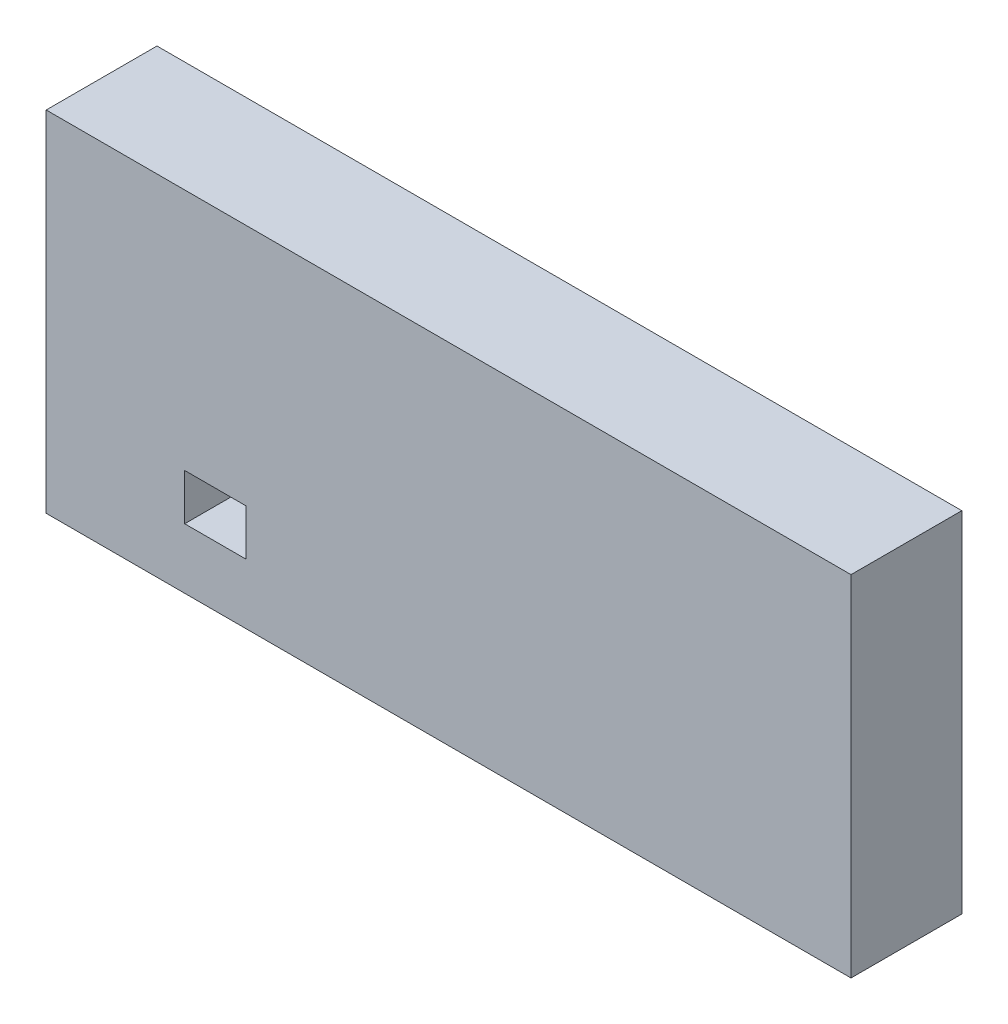
ISO-10303-21;
HEADER;
FILE_DESCRIPTION(('STEP AP214'),'2;1');
FILE_NAME('part.step','',(''),(''),'','','');
FILE_SCHEMA(('AUTOMOTIVE_DESIGN { 1 0 10303 214 1 1 1 1 }'));
ENDSEC;
DATA;
#1=APPLICATION_CONTEXT('core data for automotive mechanical design processes');
#2=APPLICATION_PROTOCOL_DEFINITION('international standard','automotive_design',2000,#1);
#3=PRODUCT_CONTEXT('',#1,'mechanical');
#4=PRODUCT('Part','Part','',(#3));
#5=PRODUCT_RELATED_PRODUCT_CATEGORY('part','',(#4));
#6=PRODUCT_DEFINITION_FORMATION('','',#4);
#7=PRODUCT_DEFINITION_CONTEXT('part definition',#1,'design');
#8=PRODUCT_DEFINITION('design','',#6,#7);
#9=PRODUCT_DEFINITION_SHAPE('','',#8);
#10=(LENGTH_UNIT() NAMED_UNIT(*) SI_UNIT(.MILLI.,.METRE.));
#11=(NAMED_UNIT(*) PLANE_ANGLE_UNIT() SI_UNIT($,.RADIAN.));
#12=(NAMED_UNIT(*) SI_UNIT($,.STERADIAN.) SOLID_ANGLE_UNIT());
#13=UNCERTAINTY_MEASURE_WITH_UNIT(LENGTH_MEASURE(1.E-05),#10,'distance_accuracy_value','');
#14=(GEOMETRIC_REPRESENTATION_CONTEXT(3) GLOBAL_UNCERTAINTY_ASSIGNED_CONTEXT((#13)) GLOBAL_UNIT_ASSIGNED_CONTEXT((#10,
#11,#12)) REPRESENTATION_CONTEXT('',''));
#15=CARTESIAN_POINT('',(0.,0.,0.));
#16=DIRECTION('',(0.,0.,1.));
#17=DIRECTION('',(1.,0.,0.));
#18=AXIS2_PLACEMENT_3D('',#15,#16,#17);
#19=CARTESIAN_POINT('',(-36.4748571428571,15.89,7.2));
#20=DIRECTION('',(1.,0.,0.));
#21=DIRECTION('',(0.,0.,-1.));
#22=AXIS2_PLACEMENT_3D('',#19,#20,#21);
#23=PLANE('',#22);
#24=DIRECTION('',(0.,-1.,0.));
#25=VECTOR('',#24,1.);
#26=CARTESIAN_POINT('',(-36.4748571428571,15.89,0.));
#27=LINE('',#26,#25);
#28=CARTESIAN_POINT('',(-36.4748571428571,15.89,0.));
#29=VERTEX_POINT('',#28);
#30=CARTESIAN_POINT('',(-36.4748571428571,-6.81,0.));
#31=VERTEX_POINT('',#30);
#32=EDGE_CURVE('E251',#29,#31,#27,.T.);
#33=ORIENTED_EDGE('',*,*,#32,.T.);
#34=DIRECTION('',(0.,0.,-1.));
#35=VECTOR('',#34,1.);
#36=CARTESIAN_POINT('',(-36.4748571428571,-6.81,7.2));
#37=LINE('',#36,#35);
#38=CARTESIAN_POINT('',(-36.4748571428571,-6.81,7.2));
#39=VERTEX_POINT('',#38);
#40=EDGE_CURVE('E11',#39,#31,#37,.T.);
#41=ORIENTED_EDGE('',*,*,#40,.F.);
#42=DIRECTION('',(0.,-1.,0.));
#43=VECTOR('',#42,1.);
#44=CARTESIAN_POINT('',(-36.4748571428571,15.89,7.2));
#45=LINE('',#44,#43);
#46=CARTESIAN_POINT('',(-36.4748571428571,15.89,7.2));
#47=VERTEX_POINT('',#46);
#48=EDGE_CURVE('E252',#47,#39,#45,.T.);
#49=ORIENTED_EDGE('',*,*,#48,.F.);
#50=DIRECTION('',(0.,0.,-1.));
#51=VECTOR('',#50,1.);
#52=CARTESIAN_POINT('',(-36.4748571428571,15.89,7.2));
#53=LINE('',#52,#51);
#54=EDGE_CURVE('E262',#47,#29,#53,.T.);
#55=ORIENTED_EDGE('',*,*,#54,.T.);
#56=EDGE_LOOP('',(#33,#41,#49,#55));
#57=FACE_BOUND('',#56,.T.);
#58=CARTESIAN_POINT('',(-36.4748571428571,8.54,2.5));
#59=DIRECTION('',(-1.,0.,0.));
#60=DIRECTION('',(0.,0.,1.));
#61=AXIS2_PLACEMENT_3D('',#58,#59,#60);
#62=CIRCLE('',#61,1.5);
#63=CARTESIAN_POINT('',(-36.4748571428571,8.54,4.));
#64=VERTEX_POINT('',#63);
#65=CARTESIAN_POINT('',(-36.4748571428571,8.54,1.));
#66=VERTEX_POINT('',#65);
#67=EDGE_CURVE('E63',#64,#66,#62,.T.);
#68=ORIENTED_EDGE('',*,*,#67,.F.);
#69=DIRECTION('',(0.,1.,0.));
#70=VECTOR('',#69,1.);
#71=CARTESIAN_POINT('',(-36.4748571428571,8.54,4.));
#72=LINE('',#71,#70);
#73=CARTESIAN_POINT('',(-36.4748571428571,0.540000000000002,4.));
#74=VERTEX_POINT('',#73);
#75=EDGE_CURVE('E195',#74,#64,#72,.T.);
#76=ORIENTED_EDGE('',*,*,#75,.F.);
#77=CARTESIAN_POINT('',(-36.4748571428571,0.540000000000002,2.5));
#78=DIRECTION('',(-1.,0.,0.));
#79=DIRECTION('',(0.,0.,1.));
#80=AXIS2_PLACEMENT_3D('',#77,#78,#79);
#81=CIRCLE('',#80,1.5);
#82=CARTESIAN_POINT('',(-36.4748571428571,0.540000000000002,1.));
#83=VERTEX_POINT('',#82);
#84=EDGE_CURVE('E206',#83,#74,#81,.T.);
#85=ORIENTED_EDGE('',*,*,#84,.F.);
#86=DIRECTION('',(0.,-1.,0.));
#87=VECTOR('',#86,1.);
#88=CARTESIAN_POINT('',(-36.4748571428571,8.54,1.));
#89=LINE('',#88,#87);
#90=EDGE_CURVE('E203',#66,#83,#89,.T.);
#91=ORIENTED_EDGE('',*,*,#90,.F.);
#92=EDGE_LOOP('',(#68,#76,#85,#91));
#93=FACE_BOUND('',#92,.T.);
#94=ADVANCED_FACE('F41',(#57,#93),#23,.F.);
#95=CARTESIAN_POINT('',(0.,0.,0.));
#96=DIRECTION('',(0.,0.,1.));
#97=DIRECTION('',(1.,0.,0.));
#98=AXIS2_PLACEMENT_3D('',#95,#96,#97);
#99=PLANE('',#98);
#100=DIRECTION('',(0.,-1.,0.));
#101=VECTOR('',#100,1.);
#102=CARTESIAN_POINT('',(9.62514285714286,-4.31,0.));
#103=LINE('',#102,#101);
#104=CARTESIAN_POINT('',(9.62514285714286,-4.31,0.));
#105=VERTEX_POINT('',#104);
#106=CARTESIAN_POINT('',(9.62514285714286,-6.81,0.));
#107=VERTEX_POINT('',#106);
#108=EDGE_CURVE('E221',#105,#107,#103,.T.);
#109=ORIENTED_EDGE('',*,*,#108,.F.);
#110=DIRECTION('',(1.,0.,0.));
#111=VECTOR('',#110,1.);
#112=CARTESIAN_POINT('',(9.62514285714286,-4.31,0.));
#113=LINE('',#112,#111);
#114=CARTESIAN_POINT('',(-30.9748571428571,-4.31,0.));
#115=VERTEX_POINT('',#114);
#116=EDGE_CURVE('E226',#115,#105,#113,.T.);
#117=ORIENTED_EDGE('',*,*,#116,.F.);
#118=DIRECTION('',(0.,1.,0.));
#119=VECTOR('',#118,1.);
#120=CARTESIAN_POINT('',(-30.9748571428571,-4.31,0.));
#121=LINE('',#120,#119);
#122=CARTESIAN_POINT('',(-30.9748571428571,-6.81,0.));
#123=VERTEX_POINT('',#122);
#124=EDGE_CURVE('E235',#123,#115,#121,.T.);
#125=ORIENTED_EDGE('',*,*,#124,.F.);
#126=DIRECTION('',(1.,0.,0.));
#127=VECTOR('',#126,1.);
#128=CARTESIAN_POINT('',(-36.4748571428571,-6.81,0.));
#129=LINE('',#128,#127);
#130=EDGE_CURVE('E266',#31,#123,#129,.T.);
#131=ORIENTED_EDGE('',*,*,#130,.F.);
#132=ORIENTED_EDGE('',*,*,#32,.F.);
#133=DIRECTION('',(-1.,0.,0.));
#134=VECTOR('',#133,1.);
#135=CARTESIAN_POINT('',(-36.4748571428571,15.89,0.));
#136=LINE('',#135,#134);
#137=CARTESIAN_POINT('',(15.8251428571429,15.89,0.));
#138=VERTEX_POINT('',#137);
#139=EDGE_CURVE('E256',#138,#29,#136,.T.);
#140=ORIENTED_EDGE('',*,*,#139,.F.);
#141=DIRECTION('',(0.,1.,0.));
#142=VECTOR('',#141,1.);
#143=CARTESIAN_POINT('',(15.8251428571429,15.89,0.));
#144=LINE('',#143,#142);
#145=CARTESIAN_POINT('',(15.8251428571429,-6.81,0.));
#146=VERTEX_POINT('',#145);
#147=EDGE_CURVE('E269',#146,#138,#144,.T.);
#148=ORIENTED_EDGE('',*,*,#147,.F.);
#149=EDGE_CURVE('E265',#107,#146,#129,.T.);
#150=ORIENTED_EDGE('',*,*,#149,.F.);
#151=EDGE_LOOP('',(#109,#117,#125,#131,#132,#140,#148,#150));
#152=FACE_BOUND('',#151,.T.);
#153=ADVANCED_FACE('F286',(#152),#99,.F.);
#154=CARTESIAN_POINT('',(-36.4748571428571,-6.81,7.2));
#155=DIRECTION('',(0.,1.,0.));
#156=DIRECTION('',(0.,0.,1.));
#157=AXIS2_PLACEMENT_3D('',#154,#155,#156);
#158=PLANE('',#157);
#159=ORIENTED_EDGE('',*,*,#130,.T.);
#160=DIRECTION('',(0.,0.,1.));
#161=VECTOR('',#160,1.);
#162=CARTESIAN_POINT('',(-30.9748571428571,-6.81,-2.));
#163=LINE('',#162,#161);
#164=CARTESIAN_POINT('',(-30.9748571428571,-6.81,-2.));
#165=VERTEX_POINT('',#164);
#166=EDGE_CURVE('E245',#165,#123,#163,.T.);
#167=ORIENTED_EDGE('',*,*,#166,.F.);
#168=DIRECTION('',(-1.,0.,0.));
#169=VECTOR('',#168,1.);
#170=CARTESIAN_POINT('',(9.62514285714286,-6.81,-2.));
#171=LINE('',#170,#169);
#172=CARTESIAN_POINT('',(9.62514285714286,-6.81,-2.));
#173=VERTEX_POINT('',#172);
#174=EDGE_CURVE('E225',#173,#165,#171,.T.);
#175=ORIENTED_EDGE('',*,*,#174,.F.);
#176=DIRECTION('',(0.,0.,1.));
#177=VECTOR('',#176,1.);
#178=CARTESIAN_POINT('',(9.62514285714286,-6.81,-2.));
#179=LINE('',#178,#177);
#180=EDGE_CURVE('E248',#173,#107,#179,.T.);
#181=ORIENTED_EDGE('',*,*,#180,.T.);
#182=ORIENTED_EDGE('',*,*,#149,.T.);
#183=DIRECTION('',(0.,0.,-1.));
#184=VECTOR('',#183,1.);
#185=CARTESIAN_POINT('',(15.8251428571429,-6.81,7.2));
#186=LINE('',#185,#184);
#187=CARTESIAN_POINT('',(15.8251428571429,-6.81,7.2));
#188=VERTEX_POINT('',#187);
#189=EDGE_CURVE('E48',#188,#146,#186,.T.);
#190=ORIENTED_EDGE('',*,*,#189,.F.);
#191=DIRECTION('',(1.,0.,0.));
#192=VECTOR('',#191,1.);
#193=CARTESIAN_POINT('',(-36.4748571428571,-6.81,7.2));
#194=LINE('',#193,#192);
#195=EDGE_CURVE('E255',#39,#188,#194,.T.);
#196=ORIENTED_EDGE('',*,*,#195,.F.);
#197=ORIENTED_EDGE('',*,*,#40,.T.);
#198=EDGE_LOOP('',(#159,#167,#175,#181,#182,#190,#196,#197));
#199=FACE_BOUND('',#198,.T.);
#200=ADVANCED_FACE('F297',(#199),#158,.F.);
#201=CARTESIAN_POINT('',(15.8251428571429,15.89,7.2));
#202=DIRECTION('',(-1.,0.,0.));
#203=DIRECTION('',(0.,0.,1.));
#204=AXIS2_PLACEMENT_3D('',#201,#202,#203);
#205=PLANE('',#204);
#206=ORIENTED_EDGE('',*,*,#147,.T.);
#207=DIRECTION('',(0.,0.,-1.));
#208=VECTOR('',#207,1.);
#209=CARTESIAN_POINT('',(15.8251428571429,15.89,7.2));
#210=LINE('',#209,#208);
#211=CARTESIAN_POINT('',(15.8251428571429,15.89,7.2));
#212=VERTEX_POINT('',#211);
#213=EDGE_CURVE('E274',#212,#138,#210,.T.);
#214=ORIENTED_EDGE('',*,*,#213,.F.);
#215=DIRECTION('',(0.,1.,0.));
#216=VECTOR('',#215,1.);
#217=CARTESIAN_POINT('',(15.8251428571429,15.89,7.2));
#218=LINE('',#217,#216);
#219=EDGE_CURVE('E258',#188,#212,#218,.T.);
#220=ORIENTED_EDGE('',*,*,#219,.F.);
#221=ORIENTED_EDGE('',*,*,#189,.T.);
#222=EDGE_LOOP('',(#206,#214,#220,#221));
#223=FACE_BOUND('',#222,.T.);
#224=ADVANCED_FACE('F281',(#223),#205,.F.);
#225=CARTESIAN_POINT('',(-36.4748571428571,15.89,7.2));
#226=DIRECTION('',(0.,-1.,0.));
#227=DIRECTION('',(0.,0.,-1.));
#228=AXIS2_PLACEMENT_3D('',#225,#226,#227);
#229=PLANE('',#228);
#230=ORIENTED_EDGE('',*,*,#139,.T.);
#231=ORIENTED_EDGE('',*,*,#54,.F.);
#232=DIRECTION('',(-1.,0.,0.));
#233=VECTOR('',#232,1.);
#234=CARTESIAN_POINT('',(-36.4748571428571,15.89,7.2));
#235=LINE('',#234,#233);
#236=EDGE_CURVE('E260',#212,#47,#235,.T.);
#237=ORIENTED_EDGE('',*,*,#236,.F.);
#238=ORIENTED_EDGE('',*,*,#213,.T.);
#239=EDGE_LOOP('',(#230,#231,#237,#238));
#240=FACE_BOUND('',#239,.T.);
#241=ADVANCED_FACE('F290',(#240),#229,.F.);
#242=CARTESIAN_POINT('',(0.,0.,7.2));
#243=DIRECTION('',(0.,0.,1.));
#244=DIRECTION('',(1.,0.,0.));
#245=AXIS2_PLACEMENT_3D('',#242,#243,#244);
#246=PLANE('',#245);
#247=DIRECTION('',(0.,-1.,0.));
#248=VECTOR('',#247,1.);
#249=CARTESIAN_POINT('',(-27.4748571428571,0.103595907845754,7.2));
#250=LINE('',#249,#248);
#251=CARTESIAN_POINT('',(-27.4748571428571,0.103595907845754,7.2));
#252=VERTEX_POINT('',#251);
#253=CARTESIAN_POINT('',(-27.4748571428571,-2.89640409215425,7.2));
#254=VERTEX_POINT('',#253);
#255=EDGE_CURVE('E55',#252,#254,#250,.T.);
#256=ORIENTED_EDGE('',*,*,#255,.F.);
#257=DIRECTION('',(-1.,0.,0.));
#258=VECTOR('',#257,1.);
#259=CARTESIAN_POINT('',(-27.4748571428571,0.103595907845754,7.2));
#260=LINE('',#259,#258);
#261=CARTESIAN_POINT('',(-23.4748571428571,0.103595907845754,7.2));
#262=VERTEX_POINT('',#261);
#263=EDGE_CURVE('E173',#262,#252,#260,.T.);
#264=ORIENTED_EDGE('',*,*,#263,.F.);
#265=DIRECTION('',(0.,1.,0.));
#266=VECTOR('',#265,1.);
#267=CARTESIAN_POINT('',(-23.4748571428571,0.103595907845754,7.2));
#268=LINE('',#267,#266);
#269=CARTESIAN_POINT('',(-23.4748571428571,-2.89640409215425,7.2));
#270=VERTEX_POINT('',#269);
#271=EDGE_CURVE('E176',#270,#262,#268,.T.);
#272=ORIENTED_EDGE('',*,*,#271,.F.);
#273=DIRECTION('',(1.,0.,0.));
#274=VECTOR('',#273,1.);
#275=CARTESIAN_POINT('',(-27.4748571428571,-2.89640409215425,7.2));
#276=LINE('',#275,#274);
#277=EDGE_CURVE('E182',#254,#270,#276,.T.);
#278=ORIENTED_EDGE('',*,*,#277,.F.);
#279=EDGE_LOOP('',(#256,#264,#272,#278));
#280=FACE_BOUND('',#279,.T.);
#281=ORIENTED_EDGE('',*,*,#48,.T.);
#282=ORIENTED_EDGE('',*,*,#195,.T.);
#283=ORIENTED_EDGE('',*,*,#219,.T.);
#284=ORIENTED_EDGE('',*,*,#236,.T.);
#285=EDGE_LOOP('',(#281,#282,#283,#284));
#286=FACE_BOUND('',#285,.T.);
#287=ADVANCED_FACE('F296',(#280,#286),#246,.T.);
#288=CARTESIAN_POINT('',(9.62514285714286,-4.31,-2.));
#289=DIRECTION('',(-1.,0.,0.));
#290=DIRECTION('',(0.,0.,1.));
#291=AXIS2_PLACEMENT_3D('',#288,#289,#290);
#292=PLANE('',#291);
#293=ORIENTED_EDGE('',*,*,#108,.T.);
#294=ORIENTED_EDGE('',*,*,#180,.F.);
#295=DIRECTION('',(0.,-1.,0.));
#296=VECTOR('',#295,1.);
#297=CARTESIAN_POINT('',(9.62514285714286,-4.31,-2.));
#298=LINE('',#297,#296);
#299=CARTESIAN_POINT('',(9.62514285714286,-4.31,-2.));
#300=VERTEX_POINT('',#299);
#301=EDGE_CURVE('E222',#300,#173,#298,.T.);
#302=ORIENTED_EDGE('',*,*,#301,.F.);
#303=DIRECTION('',(0.,0.,1.));
#304=VECTOR('',#303,1.);
#305=CARTESIAN_POINT('',(9.62514285714286,-4.31,-2.));
#306=LINE('',#305,#304);
#307=EDGE_CURVE('E232',#300,#105,#306,.T.);
#308=ORIENTED_EDGE('',*,*,#307,.T.);
#309=EDGE_LOOP('',(#293,#294,#302,#308));
#310=FACE_BOUND('',#309,.T.);
#311=ADVANCED_FACE('F310',(#310),#292,.F.);
#312=CARTESIAN_POINT('',(-30.9748571428571,-4.31,-2.));
#313=DIRECTION('',(1.,0.,0.));
#314=DIRECTION('',(0.,0.,-1.));
#315=AXIS2_PLACEMENT_3D('',#312,#313,#314);
#316=PLANE('',#315);
#317=ORIENTED_EDGE('',*,*,#124,.T.);
#318=DIRECTION('',(0.,0.,1.));
#319=VECTOR('',#318,1.);
#320=CARTESIAN_POINT('',(-30.9748571428571,-4.31,-2.));
#321=LINE('',#320,#319);
#322=CARTESIAN_POINT('',(-30.9748571428571,-4.31,-2.));
#323=VERTEX_POINT('',#322);
#324=EDGE_CURVE('E242',#323,#115,#321,.T.);
#325=ORIENTED_EDGE('',*,*,#324,.F.);
#326=DIRECTION('',(0.,1.,0.));
#327=VECTOR('',#326,1.);
#328=CARTESIAN_POINT('',(-30.9748571428571,-4.31,-2.));
#329=LINE('',#328,#327);
#330=EDGE_CURVE('E228',#165,#323,#329,.T.);
#331=ORIENTED_EDGE('',*,*,#330,.F.);
#332=ORIENTED_EDGE('',*,*,#166,.T.);
#333=EDGE_LOOP('',(#317,#325,#331,#332));
#334=FACE_BOUND('',#333,.T.);
#335=ADVANCED_FACE('F301',(#334),#316,.F.);
#336=CARTESIAN_POINT('',(9.62514285714286,-4.31,-2.));
#337=DIRECTION('',(0.,-1.,0.));
#338=DIRECTION('',(0.,0.,-1.));
#339=AXIS2_PLACEMENT_3D('',#336,#337,#338);
#340=PLANE('',#339);
#341=ORIENTED_EDGE('',*,*,#116,.T.);
#342=ORIENTED_EDGE('',*,*,#307,.F.);
#343=DIRECTION('',(1.,0.,0.));
#344=VECTOR('',#343,1.);
#345=CARTESIAN_POINT('',(9.62514285714286,-4.31,-2.));
#346=LINE('',#345,#344);
#347=EDGE_CURVE('E230',#323,#300,#346,.T.);
#348=ORIENTED_EDGE('',*,*,#347,.F.);
#349=ORIENTED_EDGE('',*,*,#324,.T.);
#350=EDGE_LOOP('',(#341,#342,#348,#349));
#351=FACE_BOUND('',#350,.T.);
#352=ADVANCED_FACE('F312',(#351),#340,.F.);
#353=CARTESIAN_POINT('',(0.,0.,-2.));
#354=DIRECTION('',(0.,0.,-1.));
#355=DIRECTION('',(-1.,0.,0.));
#356=AXIS2_PLACEMENT_3D('',#353,#354,#355);
#357=PLANE('',#356);
#358=ORIENTED_EDGE('',*,*,#301,.T.);
#359=ORIENTED_EDGE('',*,*,#174,.T.);
#360=ORIENTED_EDGE('',*,*,#330,.T.);
#361=ORIENTED_EDGE('',*,*,#347,.T.);
#362=EDGE_LOOP('',(#358,#359,#360,#361));
#363=FACE_BOUND('',#362,.T.);
#364=ADVANCED_FACE('F305',(#363),#357,.T.);
#365=CARTESIAN_POINT('',(-37.4748571428571,8.54,2.5));
#366=DIRECTION('',(1.,0.,0.));
#367=DIRECTION('',(0.,0.,-1.));
#368=AXIS2_PLACEMENT_3D('',#365,#366,#367);
#369=CYLINDRICAL_SURFACE('',#368,1.5);
#370=ORIENTED_EDGE('',*,*,#67,.T.);
#371=DIRECTION('',(1.,0.,0.));
#372=VECTOR('',#371,1.);
#373=CARTESIAN_POINT('',(-37.4748571428571,8.54,1.));
#374=LINE('',#373,#372);
#375=CARTESIAN_POINT('',(-37.4748571428571,8.54,1.));
#376=VERTEX_POINT('',#375);
#377=EDGE_CURVE('E218',#376,#66,#374,.T.);
#378=ORIENTED_EDGE('',*,*,#377,.F.);
#379=CARTESIAN_POINT('',(-37.4748571428571,8.54,2.5));
#380=DIRECTION('',(-1.,0.,0.));
#381=DIRECTION('',(0.,0.,1.));
#382=AXIS2_PLACEMENT_3D('',#379,#380,#381);
#383=CIRCLE('',#382,1.5);
#384=CARTESIAN_POINT('',(-37.4748571428571,8.54,4.));
#385=VERTEX_POINT('',#384);
#386=EDGE_CURVE('E191',#385,#376,#383,.T.);
#387=ORIENTED_EDGE('',*,*,#386,.F.);
#388=DIRECTION('',(1.,0.,0.));
#389=VECTOR('',#388,1.);
#390=CARTESIAN_POINT('',(-37.4748571428571,8.54,4.));
#391=LINE('',#390,#389);
#392=EDGE_CURVE('E201',#385,#64,#391,.T.);
#393=ORIENTED_EDGE('',*,*,#392,.T.);
#394=EDGE_LOOP('',(#370,#378,#387,#393));
#395=FACE_BOUND('',#394,.T.);
#396=ADVANCED_FACE('F319',(#395),#369,.T.);
#397=CARTESIAN_POINT('',(-37.4748571428571,8.54,1.));
#398=DIRECTION('',(0.,0.,1.));
#399=DIRECTION('',(0.,-1.,0.));
#400=AXIS2_PLACEMENT_3D('',#397,#398,#399);
#401=PLANE('',#400);
#402=ORIENTED_EDGE('',*,*,#90,.T.);
#403=DIRECTION('',(1.,0.,0.));
#404=VECTOR('',#403,1.);
#405=CARTESIAN_POINT('',(-37.4748571428571,0.540000000000002,1.));
#406=LINE('',#405,#404);
#407=CARTESIAN_POINT('',(-37.4748571428571,0.540000000000002,1.));
#408=VERTEX_POINT('',#407);
#409=EDGE_CURVE('E215',#408,#83,#406,.T.);
#410=ORIENTED_EDGE('',*,*,#409,.F.);
#411=DIRECTION('',(0.,-1.,0.));
#412=VECTOR('',#411,1.);
#413=CARTESIAN_POINT('',(-37.4748571428571,8.54,1.));
#414=LINE('',#413,#412);
#415=EDGE_CURVE('E194',#376,#408,#414,.T.);
#416=ORIENTED_EDGE('',*,*,#415,.F.);
#417=ORIENTED_EDGE('',*,*,#377,.T.);
#418=EDGE_LOOP('',(#402,#410,#416,#417));
#419=FACE_BOUND('',#418,.T.);
#420=ADVANCED_FACE('F402',(#419),#401,.F.);
#421=CARTESIAN_POINT('',(-37.4748571428571,0.540000000000002,2.5));
#422=DIRECTION('',(1.,0.,0.));
#423=DIRECTION('',(0.,0.,-1.));
#424=AXIS2_PLACEMENT_3D('',#421,#422,#423);
#425=CYLINDRICAL_SURFACE('',#424,1.5);
#426=ORIENTED_EDGE('',*,*,#84,.T.);
#427=DIRECTION('',(1.,0.,0.));
#428=VECTOR('',#427,1.);
#429=CARTESIAN_POINT('',(-37.4748571428571,0.540000000000002,4.));
#430=LINE('',#429,#428);
#431=CARTESIAN_POINT('',(-37.4748571428571,0.540000000000002,4.));
#432=VERTEX_POINT('',#431);
#433=EDGE_CURVE('E212',#432,#74,#430,.T.);
#434=ORIENTED_EDGE('',*,*,#433,.F.);
#435=CARTESIAN_POINT('',(-37.4748571428571,0.540000000000002,2.5));
#436=DIRECTION('',(-1.,0.,0.));
#437=DIRECTION('',(0.,0.,1.));
#438=AXIS2_PLACEMENT_3D('',#435,#436,#437);
#439=CIRCLE('',#438,1.5);
#440=EDGE_CURVE('E197',#408,#432,#439,.T.);
#441=ORIENTED_EDGE('',*,*,#440,.F.);
#442=ORIENTED_EDGE('',*,*,#409,.T.);
#443=EDGE_LOOP('',(#426,#434,#441,#442));
#444=FACE_BOUND('',#443,.T.);
#445=ADVANCED_FACE('F412',(#444),#425,.T.);
#446=CARTESIAN_POINT('',(-37.4748571428571,8.54,4.));
#447=DIRECTION('',(0.,0.,-1.));
#448=DIRECTION('',(0.,1.,0.));
#449=AXIS2_PLACEMENT_3D('',#446,#447,#448);
#450=PLANE('',#449);
#451=ORIENTED_EDGE('',*,*,#75,.T.);
#452=ORIENTED_EDGE('',*,*,#392,.F.);
#453=DIRECTION('',(0.,1.,0.));
#454=VECTOR('',#453,1.);
#455=CARTESIAN_POINT('',(-37.4748571428571,8.54,4.));
#456=LINE('',#455,#454);
#457=EDGE_CURVE('E199',#432,#385,#456,.T.);
#458=ORIENTED_EDGE('',*,*,#457,.F.);
#459=ORIENTED_EDGE('',*,*,#433,.T.);
#460=EDGE_LOOP('',(#451,#452,#458,#459));
#461=FACE_BOUND('',#460,.T.);
#462=ADVANCED_FACE('F422',(#461),#450,.F.);
#463=CARTESIAN_POINT('',(-37.4748571428571,8.54,2.5));
#464=DIRECTION('',(-1.,0.,0.));
#465=DIRECTION('',(0.,0.,1.));
#466=AXIS2_PLACEMENT_3D('',#463,#464,#465);
#467=PLANE('',#466);
#468=ORIENTED_EDGE('',*,*,#386,.T.);
#469=ORIENTED_EDGE('',*,*,#415,.T.);
#470=ORIENTED_EDGE('',*,*,#440,.T.);
#471=ORIENTED_EDGE('',*,*,#457,.T.);
#472=EDGE_LOOP('',(#468,#469,#470,#471));
#473=FACE_BOUND('',#472,.T.);
#474=ADVANCED_FACE('F432',(#473),#467,.T.);
#475=CARTESIAN_POINT('',(-27.4748571428571,0.103595907845754,3.6));
#476=DIRECTION('',(-1.,0.,0.));
#477=DIRECTION('',(0.,0.,1.));
#478=AXIS2_PLACEMENT_3D('',#475,#476,#477);
#479=PLANE('',#478);
#480=ORIENTED_EDGE('',*,*,#255,.T.);
#481=DIRECTION('',(0.,0.,1.));
#482=VECTOR('',#481,1.);
#483=CARTESIAN_POINT('',(-27.4748571428571,-2.89640409215425,3.6));
#484=LINE('',#483,#482);
#485=CARTESIAN_POINT('',(-27.4748571428571,-2.89640409215425,3.6));
#486=VERTEX_POINT('',#485);
#487=EDGE_CURVE('E151',#486,#254,#484,.T.);
#488=ORIENTED_EDGE('',*,*,#487,.F.);
#489=DIRECTION('',(0.,-1.,0.));
#490=VECTOR('',#489,1.);
#491=CARTESIAN_POINT('',(-27.4748571428571,0.103595907845754,3.6));
#492=LINE('',#491,#490);
#493=CARTESIAN_POINT('',(-27.4748571428571,0.103595907845754,3.6));
#494=VERTEX_POINT('',#493);
#495=EDGE_CURVE('E155',#494,#486,#492,.T.);
#496=ORIENTED_EDGE('',*,*,#495,.F.);
#497=DIRECTION('',(0.,0.,1.));
#498=VECTOR('',#497,1.);
#499=CARTESIAN_POINT('',(-27.4748571428571,0.103595907845754,3.6));
#500=LINE('',#499,#498);
#501=EDGE_CURVE('E186',#494,#252,#500,.T.);
#502=ORIENTED_EDGE('',*,*,#501,.T.);
#503=EDGE_LOOP('',(#480,#488,#496,#502));
#504=FACE_BOUND('',#503,.T.);
#505=ADVANCED_FACE('F153',(#504),#479,.F.);
#506=CARTESIAN_POINT('',(-27.4748571428571,0.103595907845754,3.6));
#507=DIRECTION('',(0.,1.,0.));
#508=DIRECTION('',(0.,0.,1.));
#509=AXIS2_PLACEMENT_3D('',#506,#507,#508);
#510=PLANE('',#509);
#511=ORIENTED_EDGE('',*,*,#263,.T.);
#512=ORIENTED_EDGE('',*,*,#501,.F.);
#513=DIRECTION('',(-1.,0.,0.));
#514=VECTOR('',#513,1.);
#515=CARTESIAN_POINT('',(-27.4748571428571,0.103595907845754,3.6));
#516=LINE('',#515,#514);
#517=CARTESIAN_POINT('',(-23.4748571428571,0.103595907845754,3.6));
#518=VERTEX_POINT('',#517);
#519=EDGE_CURVE('E161',#518,#494,#516,.T.);
#520=ORIENTED_EDGE('',*,*,#519,.F.);
#521=DIRECTION('',(0.,0.,1.));
#522=VECTOR('',#521,1.);
#523=CARTESIAN_POINT('',(-23.4748571428571,0.103595907845754,3.6));
#524=LINE('',#523,#522);
#525=EDGE_CURVE('E188',#518,#262,#524,.T.);
#526=ORIENTED_EDGE('',*,*,#525,.T.);
#527=EDGE_LOOP('',(#511,#512,#520,#526));
#528=FACE_BOUND('',#527,.T.);
#529=ADVANCED_FACE('F449',(#528),#510,.F.);
#530=CARTESIAN_POINT('',(-23.4748571428571,0.103595907845754,3.6));
#531=DIRECTION('',(1.,0.,0.));
#532=DIRECTION('',(0.,0.,-1.));
#533=AXIS2_PLACEMENT_3D('',#530,#531,#532);
#534=PLANE('',#533);
#535=ORIENTED_EDGE('',*,*,#271,.T.);
#536=ORIENTED_EDGE('',*,*,#525,.F.);
#537=DIRECTION('',(0.,1.,0.));
#538=VECTOR('',#537,1.);
#539=CARTESIAN_POINT('',(-23.4748571428571,0.103595907845754,3.6));
#540=LINE('',#539,#538);
#541=CARTESIAN_POINT('',(-23.4748571428571,-2.89640409215425,3.6));
#542=VERTEX_POINT('',#541);
#543=EDGE_CURVE('E169',#542,#518,#540,.T.);
#544=ORIENTED_EDGE('',*,*,#543,.F.);
#545=DIRECTION('',(0.,0.,1.));
#546=VECTOR('',#545,1.);
#547=CARTESIAN_POINT('',(-23.4748571428571,-2.89640409215425,3.6));
#548=LINE('',#547,#546);
#549=EDGE_CURVE('E160',#542,#270,#548,.T.);
#550=ORIENTED_EDGE('',*,*,#549,.T.);
#551=EDGE_LOOP('',(#535,#536,#544,#550));
#552=FACE_BOUND('',#551,.T.);
#553=ADVANCED_FACE('F458',(#552),#534,.F.);
#554=CARTESIAN_POINT('',(-27.4748571428571,-2.89640409215425,3.6));
#555=DIRECTION('',(0.,-1.,0.));
#556=DIRECTION('',(0.,0.,-1.));
#557=AXIS2_PLACEMENT_3D('',#554,#555,#556);
#558=PLANE('',#557);
#559=ORIENTED_EDGE('',*,*,#277,.T.);
#560=ORIENTED_EDGE('',*,*,#549,.F.);
#561=DIRECTION('',(1.,0.,0.));
#562=VECTOR('',#561,1.);
#563=CARTESIAN_POINT('',(-27.4748571428571,-2.89640409215425,3.6));
#564=LINE('',#563,#562);
#565=EDGE_CURVE('E164',#486,#542,#564,.T.);
#566=ORIENTED_EDGE('',*,*,#565,.F.);
#567=ORIENTED_EDGE('',*,*,#487,.T.);
#568=EDGE_LOOP('',(#559,#560,#566,#567));
#569=FACE_BOUND('',#568,.T.);
#570=ADVANCED_FACE('F165',(#569),#558,.F.);
#571=CARTESIAN_POINT('',(0.,0.,3.6));
#572=DIRECTION('',(0.,0.,1.));
#573=DIRECTION('',(1.,0.,0.));
#574=AXIS2_PLACEMENT_3D('',#571,#572,#573);
#575=PLANE('',#574);
#576=ORIENTED_EDGE('',*,*,#495,.T.);
#577=ORIENTED_EDGE('',*,*,#565,.T.);
#578=ORIENTED_EDGE('',*,*,#543,.T.);
#579=ORIENTED_EDGE('',*,*,#519,.T.);
#580=EDGE_LOOP('',(#576,#577,#578,#579));
#581=FACE_BOUND('',#580,.T.);
#582=ADVANCED_FACE('F171',(#581),#575,.T.);
#583=CLOSED_SHELL('',(#94,#153,#200,#224,#241,#287,#311,#335,#352,#364,#396,#420,#445,#462,#474,
#505,#529,#553,#570,#582));
#584=MANIFOLD_SOLID_BREP('B2',#583);
#585=ADVANCED_BREP_SHAPE_REPRESENTATION('',(#18,#584),#14);
#586=SHAPE_DEFINITION_REPRESENTATION(#9,#585);
ENDSEC;
END-ISO-10303-21;
